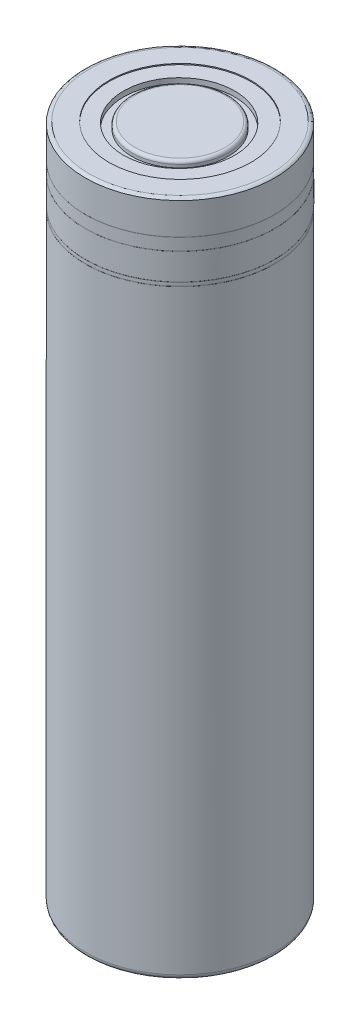
ISO-10303-21;
HEADER;
FILE_DESCRIPTION(('STEP AP214'),'2;1');
FILE_NAME('part.step','',(''),(''),'','','');
FILE_SCHEMA(('AUTOMOTIVE_DESIGN { 1 0 10303 214 1 1 1 1 }'));
ENDSEC;
DATA;
#1=APPLICATION_CONTEXT('core data for automotive mechanical design processes');
#2=APPLICATION_PROTOCOL_DEFINITION('international standard','automotive_design',2000,#1);
#3=PRODUCT_CONTEXT('',#1,'mechanical');
#4=PRODUCT('Part','Part','',(#3));
#5=PRODUCT_RELATED_PRODUCT_CATEGORY('part','',(#4));
#6=PRODUCT_DEFINITION_FORMATION('','',#4);
#7=PRODUCT_DEFINITION_CONTEXT('part definition',#1,'design');
#8=PRODUCT_DEFINITION('design','',#6,#7);
#9=PRODUCT_DEFINITION_SHAPE('','',#8);
#10=(LENGTH_UNIT() NAMED_UNIT(*) SI_UNIT(.MILLI.,.METRE.));
#11=(NAMED_UNIT(*) PLANE_ANGLE_UNIT() SI_UNIT($,.RADIAN.));
#12=(NAMED_UNIT(*) SI_UNIT($,.STERADIAN.) SOLID_ANGLE_UNIT());
#13=UNCERTAINTY_MEASURE_WITH_UNIT(LENGTH_MEASURE(1.E-05),#10,'distance_accuracy_value','');
#14=(GEOMETRIC_REPRESENTATION_CONTEXT(3) GLOBAL_UNCERTAINTY_ASSIGNED_CONTEXT((#13)) GLOBAL_UNIT_ASSIGNED_CONTEXT((#10,
#11,#12)) REPRESENTATION_CONTEXT('',''));
#15=CARTESIAN_POINT('',(0.,0.,0.));
#16=DIRECTION('',(0.,0.,1.));
#17=DIRECTION('',(1.,0.,0.));
#18=AXIS2_PLACEMENT_3D('',#15,#16,#17);
#19=CARTESIAN_POINT('',(0.,65.35,0.));
#20=DIRECTION('',(0.,1.,0.));
#21=DIRECTION('',(0.,0.,1.));
#22=AXIS2_PLACEMENT_3D('',#19,#20,#21);
#23=TOROIDAL_SURFACE('',#22,8.665,0.5);
#24=CARTESIAN_POINT('',(0.,65.85,0.));
#25=DIRECTION('',(0.,1.,0.));
#26=DIRECTION('',(0.,0.,1.));
#27=AXIS2_PLACEMENT_3D('',#24,#25,#26);
#28=CIRCLE('',#27,8.665);
#29=CARTESIAN_POINT('',(0.,65.85,8.665));
#30=VERTEX_POINT('',#29);
#31=EDGE_CURVE('E80',#30,#30,#28,.T.);
#32=ORIENTED_EDGE('',*,*,#31,.F.);
#33=EDGE_LOOP('',(#32));
#34=FACE_BOUND('',#33,.T.);
#35=CARTESIAN_POINT('',(0.,65.686303434416,0.));
#36=DIRECTION('',(0.,-1.,0.));
#37=DIRECTION('',(0.,0.,-1.));
#38=AXIS2_PLACEMENT_3D('',#35,#36,#37);
#39=CIRCLE('',#38,9.035);
#40=CARTESIAN_POINT('',(0.,65.686303434416,-9.035));
#41=VERTEX_POINT('',#40);
#42=EDGE_CURVE('E92',#41,#41,#39,.F.);
#43=ORIENTED_EDGE('',*,*,#42,.T.);
#44=EDGE_LOOP('',(#43));
#45=FACE_BOUND('',#44,.T.);
#46=ADVANCED_FACE('F37',(#34,#45),#23,.T.);
#47=CARTESIAN_POINT('',(0.,65.85,0.));
#48=DIRECTION('',(0.,1.,0.));
#49=DIRECTION('',(0.,0.,1.));
#50=AXIS2_PLACEMENT_3D('',#47,#48,#49);
#51=PLANE('',#50);
#52=CARTESIAN_POINT('',(0.,65.85,0.));
#53=DIRECTION('',(0.,1.,0.));
#54=DIRECTION('',(0.,0.,1.));
#55=AXIS2_PLACEMENT_3D('',#52,#53,#54);
#56=CIRCLE('',#55,6.78458179531968);
#57=CARTESIAN_POINT('',(0.,65.85,6.78458179531968));
#58=VERTEX_POINT('',#57);
#59=EDGE_CURVE('E77',#58,#58,#56,.T.);
#60=ORIENTED_EDGE('',*,*,#59,.F.);
#61=EDGE_LOOP('',(#60));
#62=FACE_BOUND('',#61,.T.);
#63=ORIENTED_EDGE('',*,*,#31,.T.);
#64=EDGE_LOOP('',(#63));
#65=FACE_BOUND('',#64,.T.);
#66=ADVANCED_FACE('F138',(#62,#65),#51,.T.);
#67=CARTESIAN_POINT('',(0.,65.75,0.));
#68=DIRECTION('',(0.,1.,0.));
#69=DIRECTION('',(0.,0.,1.));
#70=AXIS2_PLACEMENT_3D('',#67,#68,#69);
#71=CYLINDRICAL_SURFACE('',#70,6.78458179531968);
#72=CARTESIAN_POINT('',(0.,65.75,0.));
#73=DIRECTION('',(0.,1.,0.));
#74=DIRECTION('',(0.,0.,1.));
#75=AXIS2_PLACEMENT_3D('',#72,#73,#74);
#76=CIRCLE('',#75,6.78458179531968);
#77=CARTESIAN_POINT('',(0.,65.75,6.78458179531968));
#78=VERTEX_POINT('',#77);
#79=EDGE_CURVE('E74',#78,#78,#76,.T.);
#80=ORIENTED_EDGE('',*,*,#79,.F.);
#81=EDGE_LOOP('',(#80));
#82=FACE_BOUND('',#81,.T.);
#83=ORIENTED_EDGE('',*,*,#59,.T.);
#84=EDGE_LOOP('',(#83));
#85=FACE_BOUND('',#84,.T.);
#86=ADVANCED_FACE('F144',(#82,#85),#71,.F.);
#87=CARTESIAN_POINT('',(0.,65.75,0.));
#88=DIRECTION('',(0.,1.,0.));
#89=DIRECTION('',(0.,0.,1.));
#90=AXIS2_PLACEMENT_3D('',#87,#88,#89);
#91=PLANE('',#90);
#92=CARTESIAN_POINT('',(0.,65.75,0.0812922289983031));
#93=DIRECTION('',(0.,1.,0.));
#94=DIRECTION('',(0.,0.,1.));
#95=AXIS2_PLACEMENT_3D('',#92,#93,#94);
#96=CIRCLE('',#95,5.31676366411);
#97=CARTESIAN_POINT('',(0.,65.75,5.3980558931083));
#98=VERTEX_POINT('',#97);
#99=EDGE_CURVE('E73',#98,#98,#96,.T.);
#100=ORIENTED_EDGE('',*,*,#99,.F.);
#101=EDGE_LOOP('',(#100));
#102=FACE_BOUND('',#101,.T.);
#103=ORIENTED_EDGE('',*,*,#79,.T.);
#104=EDGE_LOOP('',(#103));
#105=FACE_BOUND('',#104,.T.);
#106=ADVANCED_FACE('F156',(#102,#105),#91,.T.);
#107=CARTESIAN_POINT('',(0.,65.25,0.0812922289983031));
#108=DIRECTION('',(0.,1.,0.));
#109=DIRECTION('',(0.,0.,1.));
#110=AXIS2_PLACEMENT_3D('',#107,#108,#109);
#111=CYLINDRICAL_SURFACE('',#110,5.31676366411);
#112=ORIENTED_EDGE('',*,*,#99,.T.);
#113=EDGE_LOOP('',(#112));
#114=FACE_BOUND('',#113,.T.);
#115=CARTESIAN_POINT('',(0.,65.25,0.0812922289983031));
#116=DIRECTION('',(0.,1.,0.));
#117=DIRECTION('',(0.,0.,1.));
#118=AXIS2_PLACEMENT_3D('',#115,#116,#117);
#119=CIRCLE('',#118,5.31676366411);
#120=CARTESIAN_POINT('',(0.,65.25,5.3980558931083));
#121=VERTEX_POINT('',#120);
#122=EDGE_CURVE('E70',#121,#121,#119,.T.);
#123=ORIENTED_EDGE('',*,*,#122,.F.);
#124=EDGE_LOOP('',(#123));
#125=FACE_BOUND('',#124,.T.);
#126=ADVANCED_FACE('F160',(#114,#125),#111,.F.);
#127=CARTESIAN_POINT('',(0.,65.25,0.0812922289983031));
#128=DIRECTION('',(0.,1.,0.));
#129=DIRECTION('',(0.,0.,1.));
#130=AXIS2_PLACEMENT_3D('',#127,#128,#129);
#131=PLANE('',#130);
#132=CARTESIAN_POINT('',(0.,65.25,0.));
#133=DIRECTION('',(0.,1.,0.));
#134=DIRECTION('',(0.,0.,1.));
#135=AXIS2_PLACEMENT_3D('',#132,#133,#134);
#136=CIRCLE('',#135,4.6044453575515);
#137=CARTESIAN_POINT('',(0.,65.25,4.6044453575515));
#138=VERTEX_POINT('',#137);
#139=EDGE_CURVE('E66',#138,#138,#136,.T.);
#140=ORIENTED_EDGE('',*,*,#139,.F.);
#141=EDGE_LOOP('',(#140));
#142=FACE_BOUND('',#141,.T.);
#143=ORIENTED_EDGE('',*,*,#122,.T.);
#144=EDGE_LOOP('',(#143));
#145=FACE_BOUND('',#144,.T.);
#146=ADVANCED_FACE('F164',(#142,#145),#131,.T.);
#147=CARTESIAN_POINT('',(0.,65.25,0.));
#148=DIRECTION('',(0.,1.,0.));
#149=DIRECTION('',(0.,0.,1.));
#150=AXIS2_PLACEMENT_3D('',#147,#148,#149);
#151=CYLINDRICAL_SURFACE('',#150,4.6044453575515);
#152=CARTESIAN_POINT('',(0.,65.55,0.));
#153=DIRECTION('',(0.,1.,0.));
#154=DIRECTION('',(0.,0.,1.));
#155=AXIS2_PLACEMENT_3D('',#152,#153,#154);
#156=CIRCLE('',#155,4.6044453575515);
#157=CARTESIAN_POINT('',(0.,65.55,4.6044453575515));
#158=VERTEX_POINT('',#157);
#159=EDGE_CURVE('E69',#158,#158,#156,.F.);
#160=ORIENTED_EDGE('',*,*,#159,.T.);
#161=EDGE_LOOP('',(#160));
#162=FACE_BOUND('',#161,.T.);
#163=ORIENTED_EDGE('',*,*,#139,.T.);
#164=EDGE_LOOP('',(#163));
#165=FACE_BOUND('',#164,.T.);
#166=ADVANCED_FACE('F168',(#162,#165),#151,.T.);
#167=CARTESIAN_POINT('',(0.,65.85,0.));
#168=DIRECTION('',(0.,1.,0.));
#169=DIRECTION('',(0.,0.,1.));
#170=AXIS2_PLACEMENT_3D('',#167,#168,#169);
#171=CIRCLE('',#170,4.3044453575515);
#172=CARTESIAN_POINT('',(0.,65.85,4.3044453575515));
#173=VERTEX_POINT('',#172);
#174=EDGE_CURVE('E65',#173,#173,#171,.T.);
#175=ORIENTED_EDGE('',*,*,#174,.T.);
#176=EDGE_LOOP('',(#175));
#177=FACE_BOUND('',#176,.T.);
#178=ADVANCED_FACE('F147',(#177),#51,.T.);
#179=CARTESIAN_POINT('',(0.,65.55,0.));
#180=DIRECTION('',(0.,1.,0.));
#181=DIRECTION('',(0.,0.,1.));
#182=AXIS2_PLACEMENT_3D('',#179,#180,#181);
#183=TOROIDAL_SURFACE('',#182,4.3044453575515,0.3);
#184=ORIENTED_EDGE('',*,*,#159,.F.);
#185=EDGE_LOOP('',(#184));
#186=FACE_BOUND('',#185,.T.);
#187=ORIENTED_EDGE('',*,*,#174,.F.);
#188=EDGE_LOOP('',(#187));
#189=FACE_BOUND('',#188,.T.);
#190=ADVANCED_FACE('F151',(#186,#189),#183,.T.);
#191=CARTESIAN_POINT('',(0.,65.85,0.));
#192=DIRECTION('',(0.,-1.,0.));
#193=DIRECTION('',(0.,0.,-1.));
#194=AXIS2_PLACEMENT_3D('',#191,#192,#193);
#195=CYLINDRICAL_SURFACE('',#194,9.035);
#196=ORIENTED_EDGE('',*,*,#42,.F.);
#197=EDGE_LOOP('',(#196));
#198=FACE_BOUND('',#197,.T.);
#199=CARTESIAN_POINT('',(0.,62.6701606004951,0.));
#200=DIRECTION('',(0.,-1.,0.));
#201=DIRECTION('',(0.,0.,-1.));
#202=AXIS2_PLACEMENT_3D('',#199,#200,#201);
#203=CIRCLE('',#202,9.035);
#204=CARTESIAN_POINT('',(0.,62.6701606004951,-9.035));
#205=VERTEX_POINT('',#204);
#206=EDGE_CURVE('E95',#205,#205,#203,.F.);
#207=ORIENTED_EDGE('',*,*,#206,.T.);
#208=EDGE_LOOP('',(#207));
#209=FACE_BOUND('',#208,.T.);
#210=ADVANCED_FACE('F135',(#198,#209),#195,.T.);
#211=CARTESIAN_POINT('',(0.,62.6389356105031,0.));
#212=DIRECTION('',(0.,1.,0.));
#213=DIRECTION('',(0.,0.,1.));
#214=AXIS2_PLACEMENT_3D('',#211,#212,#213);
#215=TOROIDAL_SURFACE('',#214,9.13,0.1);
#216=CARTESIAN_POINT('',(0.,62.6389356105031,0.));
#217=DIRECTION('',(0.,1.,0.));
#218=DIRECTION('',(0.,0.,1.));
#219=AXIS2_PLACEMENT_3D('',#216,#217,#218);
#220=CIRCLE('',#219,9.03);
#221=CARTESIAN_POINT('',(0.,62.6389356105031,9.03));
#222=VERTEX_POINT('',#221);
#223=EDGE_CURVE('E62',#222,#222,#220,.F.);
#224=ORIENTED_EDGE('',*,*,#223,.F.);
#225=EDGE_LOOP('',(#224));
#226=FACE_BOUND('',#225,.T.);
#227=ORIENTED_EDGE('',*,*,#206,.F.);
#228=EDGE_LOOP('',(#227));
#229=FACE_BOUND('',#228,.T.);
#230=ADVANCED_FACE('F173',(#226,#229),#215,.F.);
#231=CARTESIAN_POINT('',(0.,61.4389356105031,0.));
#232=DIRECTION('',(0.,1.,0.));
#233=DIRECTION('',(0.,0.,1.));
#234=AXIS2_PLACEMENT_3D('',#231,#232,#233);
#235=CYLINDRICAL_SURFACE('',#234,9.03);
#236=CARTESIAN_POINT('',(0.,61.5116672237414,0.));
#237=DIRECTION('',(0.,-1.,0.));
#238=DIRECTION('',(0.,0.,-1.));
#239=AXIS2_PLACEMENT_3D('',#236,#237,#238);
#240=CIRCLE('',#239,9.03);
#241=CARTESIAN_POINT('',(0.,61.5116672237414,-9.03));
#242=VERTEX_POINT('',#241);
#243=EDGE_CURVE('E52',#242,#242,#240,.F.);
#244=ORIENTED_EDGE('',*,*,#243,.T.);
#245=EDGE_LOOP('',(#244));
#246=FACE_BOUND('',#245,.T.);
#247=ORIENTED_EDGE('',*,*,#223,.T.);
#248=EDGE_LOOP('',(#247));
#249=FACE_BOUND('',#248,.T.);
#250=ADVANCED_FACE('F176',(#246,#249),#235,.T.);
#251=CARTESIAN_POINT('',(0.,61.5116672237414,0.));
#252=DIRECTION('',(0.,-1.,0.));
#253=DIRECTION('',(0.,0.,-1.));
#254=AXIS2_PLACEMENT_3D('',#251,#252,#253);
#255=TOROIDAL_SURFACE('',#254,9.13,0.1);
#256=ORIENTED_EDGE('',*,*,#243,.F.);
#257=EDGE_LOOP('',(#256));
#258=FACE_BOUND('',#257,.T.);
#259=CARTESIAN_POINT('',(0.,61.4804422337494,0.));
#260=DIRECTION('',(0.,1.,0.));
#261=DIRECTION('',(0.,0.,1.));
#262=AXIS2_PLACEMENT_3D('',#259,#260,#261);
#263=CIRCLE('',#262,9.035);
#264=CARTESIAN_POINT('',(0.,61.4804422337494,9.035));
#265=VERTEX_POINT('',#264);
#266=EDGE_CURVE('E57',#265,#265,#263,.F.);
#267=ORIENTED_EDGE('',*,*,#266,.F.);
#268=EDGE_LOOP('',(#267));
#269=FACE_BOUND('',#268,.T.);
#270=ADVANCED_FACE('F178',(#258,#269),#255,.F.);
#271=CARTESIAN_POINT('',(0.,58.948483499218,0.));
#272=DIRECTION('',(0.,-1.,0.));
#273=DIRECTION('',(0.,0.,-1.));
#274=AXIS2_PLACEMENT_3D('',#271,#272,#273);
#275=CIRCLE('',#274,9.035);
#276=CARTESIAN_POINT('',(0.,58.948483499218,-9.035));
#277=VERTEX_POINT('',#276);
#278=EDGE_CURVE('E55',#277,#277,#275,.F.);
#279=ORIENTED_EDGE('',*,*,#278,.T.);
#280=EDGE_LOOP('',(#279));
#281=FACE_BOUND('',#280,.T.);
#282=ORIENTED_EDGE('',*,*,#266,.T.);
#283=EDGE_LOOP('',(#282));
#284=FACE_BOUND('',#283,.T.);
#285=ADVANCED_FACE('F134',(#281,#284),#195,.T.);
#286=CARTESIAN_POINT('',(0.,58.5998287928989,0.));
#287=DIRECTION('',(0.,-1.,0.));
#288=DIRECTION('',(0.,0.,-1.));
#289=AXIS2_PLACEMENT_3D('',#286,#287,#288);
#290=TOROIDAL_SURFACE('',#289,9.12855086487638,0.1);
#291=CARTESIAN_POINT('',(0.,58.5998287928989,0.));
#292=DIRECTION('',(0.,-1.,0.));
#293=DIRECTION('',(0.,0.,-1.));
#294=AXIS2_PLACEMENT_3D('',#291,#292,#293);
#295=CIRCLE('',#294,9.02855086487638);
#296=CARTESIAN_POINT('',(0.,58.5998287928989,-9.02855086487638));
#297=VERTEX_POINT('',#296);
#298=EDGE_CURVE('E83',#297,#297,#295,.F.);
#299=ORIENTED_EDGE('',*,*,#298,.F.);
#300=EDGE_LOOP('',(#299));
#301=FACE_BOUND('',#300,.T.);
#302=CARTESIAN_POINT('',(0.,58.5644984138904,0.));
#303=DIRECTION('',(0.,1.,0.));
#304=DIRECTION('',(0.,0.,1.));
#305=AXIS2_PLACEMENT_3D('',#302,#303,#304);
#306=CIRCLE('',#305,9.035);
#307=CARTESIAN_POINT('',(0.,58.5644984138904,9.035));
#308=VERTEX_POINT('',#307);
#309=EDGE_CURVE('E98',#308,#308,#306,.F.);
#310=ORIENTED_EDGE('',*,*,#309,.F.);
#311=EDGE_LOOP('',(#310));
#312=FACE_BOUND('',#311,.T.);
#313=ADVANCED_FACE('F187',(#301,#312),#290,.F.);
#314=CARTESIAN_POINT('',(0.,58.5264909565542,0.));
#315=DIRECTION('',(0.,1.,0.));
#316=DIRECTION('',(0.,0.,1.));
#317=AXIS2_PLACEMENT_3D('',#314,#315,#316);
#318=CYLINDRICAL_SURFACE('',#317,9.02855086487638);
#319=CARTESIAN_POINT('',(0.,58.9131531202096,0.));
#320=DIRECTION('',(0.,-1.,0.));
#321=DIRECTION('',(0.,0.,-1.));
#322=AXIS2_PLACEMENT_3D('',#319,#320,#321);
#323=CIRCLE('',#322,9.02855086487638);
#324=CARTESIAN_POINT('',(0.,58.9131531202096,-9.02855086487638));
#325=VERTEX_POINT('',#324);
#326=EDGE_CURVE('E48',#325,#325,#323,.T.);
#327=ORIENTED_EDGE('',*,*,#326,.T.);
#328=EDGE_LOOP('',(#327));
#329=FACE_BOUND('',#328,.T.);
#330=ORIENTED_EDGE('',*,*,#298,.T.);
#331=EDGE_LOOP('',(#330));
#332=FACE_BOUND('',#331,.T.);
#333=ADVANCED_FACE('F182',(#329,#332),#318,.T.);
#334=CARTESIAN_POINT('',(0.,58.9131531202096,0.));
#335=DIRECTION('',(0.,-1.,0.));
#336=DIRECTION('',(0.,0.,-1.));
#337=AXIS2_PLACEMENT_3D('',#334,#335,#336);
#338=TOROIDAL_SURFACE('',#337,9.12855086487638,0.1);
#339=ORIENTED_EDGE('',*,*,#326,.F.);
#340=EDGE_LOOP('',(#339));
#341=FACE_BOUND('',#340,.T.);
#342=ORIENTED_EDGE('',*,*,#278,.F.);
#343=EDGE_LOOP('',(#342));
#344=FACE_BOUND('',#343,.T.);
#345=ADVANCED_FACE('F132',(#341,#344),#338,.F.);
#346=CARTESIAN_POINT('',(0.,1.65000000000001,0.));
#347=DIRECTION('',(0.,1.,0.));
#348=DIRECTION('',(0.,0.,1.));
#349=AXIS2_PLACEMENT_3D('',#346,#347,#348);
#350=CIRCLE('',#349,9.035);
#351=CARTESIAN_POINT('',(0.,1.65000000000001,9.035));
#352=VERTEX_POINT('',#351);
#353=EDGE_CURVE('E11',#352,#352,#350,.T.);
#354=ORIENTED_EDGE('',*,*,#353,.T.);
#355=EDGE_LOOP('',(#354));
#356=FACE_BOUND('',#355,.T.);
#357=ORIENTED_EDGE('',*,*,#309,.T.);
#358=EDGE_LOOP('',(#357));
#359=FACE_BOUND('',#358,.T.);
#360=ADVANCED_FACE('F125',(#356,#359),#195,.T.);
#361=CARTESIAN_POINT('',(-12.8371555655266,1.15000000000001,-9.035));
#362=DIRECTION('',(0.,1.,0.));
#363=DIRECTION('',(0.,0.,1.));
#364=AXIS2_PLACEMENT_3D('',#361,#362,#363);
#365=PLANE('',#364);
#366=CARTESIAN_POINT('',(0.,1.15000000000001,0.));
#367=DIRECTION('',(0.,-1.,0.));
#368=DIRECTION('',(0.,0.,-1.));
#369=AXIS2_PLACEMENT_3D('',#366,#367,#368);
#370=CIRCLE('',#369,6.5);
#371=CARTESIAN_POINT('',(0.,1.15000000000001,-6.5));
#372=VERTEX_POINT('',#371);
#373=EDGE_CURVE('E109',#372,#372,#370,.T.);
#374=ORIENTED_EDGE('',*,*,#373,.F.);
#375=EDGE_LOOP('',(#374));
#376=FACE_BOUND('',#375,.T.);
#377=CARTESIAN_POINT('',(0.,1.15000000000001,0.));
#378=DIRECTION('',(0.,1.,0.));
#379=DIRECTION('',(0.,0.,1.));
#380=AXIS2_PLACEMENT_3D('',#377,#378,#379);
#381=CIRCLE('',#380,8.535);
#382=CARTESIAN_POINT('',(0.,1.15000000000001,8.535));
#383=VERTEX_POINT('',#382);
#384=EDGE_CURVE('E44',#383,#383,#381,.F.);
#385=ORIENTED_EDGE('',*,*,#384,.T.);
#386=EDGE_LOOP('',(#385));
#387=FACE_BOUND('',#386,.T.);
#388=ADVANCED_FACE('F123',(#376,#387),#365,.F.);
#389=CARTESIAN_POINT('',(0.,1.65000000000001,0.));
#390=DIRECTION('',(0.,1.,0.));
#391=DIRECTION('',(0.,0.,1.));
#392=AXIS2_PLACEMENT_3D('',#389,#390,#391);
#393=TOROIDAL_SURFACE('',#392,8.535,0.5);
#394=ORIENTED_EDGE('',*,*,#353,.F.);
#395=EDGE_LOOP('',(#394));
#396=FACE_BOUND('',#395,.T.);
#397=ORIENTED_EDGE('',*,*,#384,.F.);
#398=EDGE_LOOP('',(#397));
#399=FACE_BOUND('',#398,.T.);
#400=ADVANCED_FACE('F39',(#396,#399),#393,.T.);
#401=CARTESIAN_POINT('',(0.,1.25000000000001,0.));
#402=DIRECTION('',(0.,-1.,0.));
#403=DIRECTION('',(0.,0.,-1.));
#404=AXIS2_PLACEMENT_3D('',#401,#402,#403);
#405=CYLINDRICAL_SURFACE('',#404,6.5);
#406=CARTESIAN_POINT('',(0.,1.25000000000001,0.));
#407=DIRECTION('',(0.,-1.,0.));
#408=DIRECTION('',(0.,0.,-1.));
#409=AXIS2_PLACEMENT_3D('',#406,#407,#408);
#410=CIRCLE('',#409,6.5);
#411=CARTESIAN_POINT('',(0.,1.25000000000001,-6.5));
#412=VERTEX_POINT('',#411);
#413=EDGE_CURVE('E108',#412,#412,#410,.T.);
#414=ORIENTED_EDGE('',*,*,#413,.F.);
#415=EDGE_LOOP('',(#414));
#416=FACE_BOUND('',#415,.T.);
#417=ORIENTED_EDGE('',*,*,#373,.T.);
#418=EDGE_LOOP('',(#417));
#419=FACE_BOUND('',#418,.T.);
#420=ADVANCED_FACE('F117',(#416,#419),#405,.F.);
#421=CARTESIAN_POINT('',(0.,1.25000000000001,0.));
#422=DIRECTION('',(0.,-1.,0.));
#423=DIRECTION('',(0.,0.,-1.));
#424=AXIS2_PLACEMENT_3D('',#421,#422,#423);
#425=PLANE('',#424);
#426=ORIENTED_EDGE('',*,*,#413,.T.);
#427=EDGE_LOOP('',(#426));
#428=FACE_BOUND('',#427,.T.);
#429=ADVANCED_FACE('F115',(#428),#425,.T.);
#430=CLOSED_SHELL('',(#46,#66,#86,#106,#126,#146,#166,#178,#190,#210,#230,#250,#270,#285,#313,
#333,#345,#360,#388,#400,#420,#429));
#431=CARTESIAN_POINT('',(0.,63.85,0.));
#432=DIRECTION('',(0.,1.,0.));
#433=DIRECTION('',(0.,0.,1.));
#434=AXIS2_PLACEMENT_3D('',#431,#432,#433);
#435=PLANE('',#434);
#436=CARTESIAN_POINT('',(0.,63.85,0.));
#437=DIRECTION('',(0.,1.,0.));
#438=DIRECTION('',(0.,0.,1.));
#439=AXIS2_PLACEMENT_3D('',#436,#437,#438);
#440=CIRCLE('',#439,7.3654845312251);
#441=CARTESIAN_POINT('',(0.,63.85,-7.3654845312251));
#442=VERTEX_POINT('',#441);
#443=EDGE_CURVE('E58',#442,#442,#440,.F.);
#444=ORIENTED_EDGE('',*,*,#443,.T.);
#445=EDGE_LOOP('',(#444));
#446=FACE_BOUND('',#445,.T.);
#447=ADVANCED_FACE('F350',(#446),#435,.F.);
#448=CARTESIAN_POINT('',(0.,3.6,0.));
#449=DIRECTION('',(0.,-1.,0.));
#450=DIRECTION('',(0.,0.,-1.));
#451=AXIS2_PLACEMENT_3D('',#448,#449,#450);
#452=PLANE('',#451);
#453=CARTESIAN_POINT('',(0.,3.6,0.));
#454=DIRECTION('',(0.,-1.,0.));
#455=DIRECTION('',(0.,0.,-1.));
#456=AXIS2_PLACEMENT_3D('',#453,#454,#455);
#457=CIRCLE('',#456,7.3654845312251);
#458=CARTESIAN_POINT('',(0.,3.59999999999999,-7.3654845312251));
#459=VERTEX_POINT('',#458);
#460=EDGE_CURVE('E105',#459,#459,#457,.T.);
#461=ORIENTED_EDGE('',*,*,#460,.F.);
#462=EDGE_LOOP('',(#461));
#463=FACE_BOUND('',#462,.T.);
#464=ADVANCED_FACE('F355',(#463),#452,.F.);
#465=CARTESIAN_POINT('',(0.,86.6827362350156,0.));
#466=DIRECTION('',(0.,-1.,0.));
#467=DIRECTION('',(0.,0.,-1.));
#468=AXIS2_PLACEMENT_3D('',#465,#466,#467);
#469=CYLINDRICAL_SURFACE('',#468,7.3654845312251);
#470=CARTESIAN_POINT('',(0.,3.59999999999999,-7.3654845312251));
#471=CARTESIAN_POINT('',(0.,4.22760416666666,-7.3654845312251));
#472=CARTESIAN_POINT('',(0.,4.85520833333332,-7.3654845312251));
#473=CARTESIAN_POINT('',(0.,6.11041666666666,-7.3654845312251));
#474=CARTESIAN_POINT('',(0.,6.73802083333332,-7.3654845312251));
#475=CARTESIAN_POINT('',(0.,7.99322916666666,-7.3654845312251));
#476=CARTESIAN_POINT('',(0.,8.62083333333333,-7.3654845312251));
#477=CARTESIAN_POINT('',(0.,9.87604166666666,-7.3654845312251));
#478=CARTESIAN_POINT('',(0.,10.5036458333333,-7.3654845312251));
#479=CARTESIAN_POINT('',(0.,11.7588541666667,-7.3654845312251));
#480=CARTESIAN_POINT('',(0.,12.3864583333333,-7.3654845312251));
#481=CARTESIAN_POINT('',(0.,13.6416666666667,-7.3654845312251));
#482=CARTESIAN_POINT('',(0.,14.2692708333333,-7.3654845312251));
#483=CARTESIAN_POINT('',(0.,15.5244791666667,-7.3654845312251));
#484=CARTESIAN_POINT('',(0.,16.1520833333333,-7.3654845312251));
#485=CARTESIAN_POINT('',(0.,17.4072916666667,-7.3654845312251));
#486=CARTESIAN_POINT('',(0.,18.0348958333333,-7.3654845312251));
#487=CARTESIAN_POINT('',(0.,19.2901041666667,-7.3654845312251));
#488=CARTESIAN_POINT('',(0.,19.9177083333333,-7.3654845312251));
#489=CARTESIAN_POINT('',(0.,21.1729166666667,-7.3654845312251));
#490=CARTESIAN_POINT('',(0.,21.8005208333333,-7.3654845312251));
#491=CARTESIAN_POINT('',(0.,23.0557291666667,-7.3654845312251));
#492=CARTESIAN_POINT('',(0.,23.6833333333333,-7.3654845312251));
#493=CARTESIAN_POINT('',(0.,24.9385416666667,-7.3654845312251));
#494=CARTESIAN_POINT('',(0.,25.5661458333333,-7.3654845312251));
#495=CARTESIAN_POINT('',(0.,26.8213541666667,-7.3654845312251));
#496=CARTESIAN_POINT('',(0.,27.4489583333333,-7.3654845312251));
#497=CARTESIAN_POINT('',(0.,28.7041666666667,-7.3654845312251));
#498=CARTESIAN_POINT('',(0.,29.3317708333333,-7.3654845312251));
#499=CARTESIAN_POINT('',(0.,30.5869791666667,-7.3654845312251));
#500=CARTESIAN_POINT('',(0.,31.2145833333333,-7.3654845312251));
#501=CARTESIAN_POINT('',(0.,32.4697916666667,-7.3654845312251));
#502=CARTESIAN_POINT('',(0.,33.0973958333333,-7.3654845312251));
#503=CARTESIAN_POINT('',(0.,34.3526041666667,-7.3654845312251));
#504=CARTESIAN_POINT('',(0.,34.9802083333333,-7.3654845312251));
#505=CARTESIAN_POINT('',(0.,36.2354166666667,-7.3654845312251));
#506=CARTESIAN_POINT('',(0.,36.8630208333333,-7.3654845312251));
#507=CARTESIAN_POINT('',(0.,38.1182291666667,-7.3654845312251));
#508=CARTESIAN_POINT('',(0.,38.7458333333333,-7.3654845312251));
#509=CARTESIAN_POINT('',(0.,40.0010416666667,-7.3654845312251));
#510=CARTESIAN_POINT('',(0.,40.6286458333333,-7.3654845312251));
#511=CARTESIAN_POINT('',(0.,41.8838541666667,-7.3654845312251));
#512=CARTESIAN_POINT('',(0.,42.5114583333333,-7.3654845312251));
#513=CARTESIAN_POINT('',(0.,43.7666666666667,-7.3654845312251));
#514=CARTESIAN_POINT('',(0.,44.3942708333333,-7.3654845312251));
#515=CARTESIAN_POINT('',(0.,45.6494791666667,-7.3654845312251));
#516=CARTESIAN_POINT('',(0.,46.2770833333333,-7.3654845312251));
#517=CARTESIAN_POINT('',(0.,47.5322916666667,-7.3654845312251));
#518=CARTESIAN_POINT('',(0.,48.1598958333333,-7.3654845312251));
#519=CARTESIAN_POINT('',(0.,49.4151041666667,-7.3654845312251));
#520=CARTESIAN_POINT('',(0.,50.0427083333333,-7.3654845312251));
#521=CARTESIAN_POINT('',(0.,51.2979166666667,-7.3654845312251));
#522=CARTESIAN_POINT('',(0.,51.9255208333333,-7.3654845312251));
#523=CARTESIAN_POINT('',(0.,53.1807291666667,-7.3654845312251));
#524=CARTESIAN_POINT('',(0.,53.8083333333333,-7.3654845312251));
#525=CARTESIAN_POINT('',(0.,55.0635416666667,-7.3654845312251));
#526=CARTESIAN_POINT('',(0.,55.6911458333333,-7.3654845312251));
#527=CARTESIAN_POINT('',(0.,56.9463541666667,-7.3654845312251));
#528=CARTESIAN_POINT('',(0.,57.5739583333333,-7.3654845312251));
#529=CARTESIAN_POINT('',(0.,58.8291666666667,-7.3654845312251));
#530=CARTESIAN_POINT('',(0.,59.4567708333333,-7.3654845312251));
#531=CARTESIAN_POINT('',(0.,60.7119791666667,-7.3654845312251));
#532=CARTESIAN_POINT('',(0.,61.3395833333333,-7.3654845312251));
#533=CARTESIAN_POINT('',(0.,62.5947916666667,-7.3654845312251));
#534=CARTESIAN_POINT('',(0.,63.2223958333333,-7.3654845312251));
#535=CARTESIAN_POINT('',(0.,63.85,-7.3654845312251));
#536=B_SPLINE_CURVE_WITH_KNOTS('',3,(#470,#471,#472,#473,#474,#475,#476,#477,#478,#479,#480,
#481,#482,#483,#484,#485,#486,#487,#488,#489,#490,#491,#492,#493,#494,#495,#496,#497,#498,#499,
#500,#501,#502,#503,#504,#505,#506,#507,#508,#509,#510,#511,#512,#513,#514,#515,#516,#517,#518,
#519,#520,#521,#522,#523,#524,#525,#526,#527,#528,#529,#530,#531,#532,#533,#534,#535),
.UNSPECIFIED.,.F.,.F.,(4,2,2,2,2,2,2,2,2,2,2,2,2,2,2,2,2,2,2,2,2,2,2,2,2,2,2,2,2,2,2,2,4),(0.,
1.8828125,3.76562499999999,5.64843750000001,7.53125,9.4140625,11.296875,13.1796875,15.0625,
16.9453125,18.828125,20.7109375,22.59375,24.4765625,26.359375,28.2421875,30.125,32.0078125,
33.890625,35.7734375,37.65625,39.5390625,41.421875,43.3046875,45.1875,47.0703125,48.953125,
50.8359375,52.71875,54.6015625,56.484375,58.3671875,60.25),.UNSPECIFIED.);
#537=EDGE_CURVE('BSEAM364',#459,#442,#536,.T.);
#538=ORIENTED_EDGE('',*,*,#460,.T.);
#539=ORIENTED_EDGE('',*,*,#443,.F.);
#540=ORIENTED_EDGE('',*,*,#537,.T.);
#541=ORIENTED_EDGE('',*,*,#537,.F.);
#542=EDGE_LOOP('',(#538,#540,#539,#541));
#543=FACE_BOUND('',#542,.T.);
#544=ADVANCED_FACE('F364',(#543),#469,.F.);
#545=CLOSED_SHELL('',(#447,#464,#544));
#546=ORIENTED_CLOSED_SHELL('',*,#545,.T.);
#547=BREP_WITH_VOIDS('B2',#430,(#546));
#548=ADVANCED_BREP_SHAPE_REPRESENTATION('',(#18,#547),#14);
#549=SHAPE_DEFINITION_REPRESENTATION(#9,#548);
ENDSEC;
END-ISO-10303-21;
